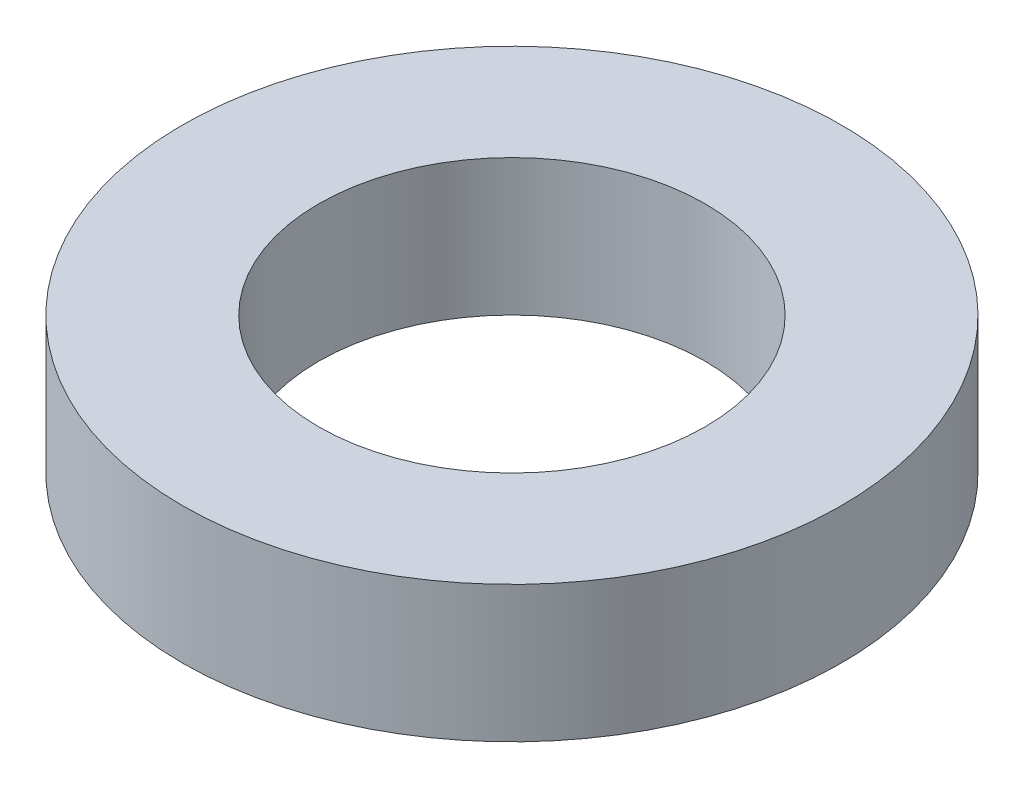
ISO-10303-21;
HEADER;
FILE_DESCRIPTION(('STEP AP214'),'2;1');
FILE_NAME('part.step','',(''),(''),'','','');
FILE_SCHEMA(('AUTOMOTIVE_DESIGN { 1 0 10303 214 1 1 1 1 }'));
ENDSEC;
DATA;
#1=APPLICATION_CONTEXT('core data for automotive mechanical design processes');
#2=APPLICATION_PROTOCOL_DEFINITION('international standard','automotive_design',2000,#1);
#3=PRODUCT_CONTEXT('',#1,'mechanical');
#4=PRODUCT('Part','Part','',(#3));
#5=PRODUCT_RELATED_PRODUCT_CATEGORY('part','',(#4));
#6=PRODUCT_DEFINITION_FORMATION('','',#4);
#7=PRODUCT_DEFINITION_CONTEXT('part definition',#1,'design');
#8=PRODUCT_DEFINITION('design','',#6,#7);
#9=PRODUCT_DEFINITION_SHAPE('','',#8);
#10=(LENGTH_UNIT() NAMED_UNIT(*) SI_UNIT(.MILLI.,.METRE.));
#11=(NAMED_UNIT(*) PLANE_ANGLE_UNIT() SI_UNIT($,.RADIAN.));
#12=(NAMED_UNIT(*) SI_UNIT($,.STERADIAN.) SOLID_ANGLE_UNIT());
#13=UNCERTAINTY_MEASURE_WITH_UNIT(LENGTH_MEASURE(1.E-05),#10,'distance_accuracy_value','');
#14=(GEOMETRIC_REPRESENTATION_CONTEXT(3) GLOBAL_UNCERTAINTY_ASSIGNED_CONTEXT((#13)) GLOBAL_UNIT_ASSIGNED_CONTEXT((#10,
#11,#12)) REPRESENTATION_CONTEXT('',''));
#15=CARTESIAN_POINT('',(0.,0.,0.));
#16=DIRECTION('',(0.,0.,1.));
#17=DIRECTION('',(1.,0.,0.));
#18=AXIS2_PLACEMENT_3D('',#15,#16,#17);
#19=CARTESIAN_POINT('',(0.,3.,0.));
#20=DIRECTION('',(0.,1.,0.));
#21=DIRECTION('',(0.,0.,1.));
#22=AXIS2_PLACEMENT_3D('',#19,#20,#21);
#23=PLANE('',#22);
#24=CARTESIAN_POINT('',(0.,3.,0.));
#25=DIRECTION('',(0.,1.,0.));
#26=DIRECTION('',(0.,0.,1.));
#27=AXIS2_PLACEMENT_3D('',#24,#25,#26);
#28=CIRCLE('',#27,7.25);
#29=CARTESIAN_POINT('',(0.,3.,7.25));
#30=VERTEX_POINT('',#29);
#31=EDGE_CURVE('E10',#30,#30,#28,.T.);
#32=ORIENTED_EDGE('',*,*,#31,.T.);
#33=EDGE_LOOP('',(#32));
#34=FACE_BOUND('',#33,.T.);
#35=CARTESIAN_POINT('',(0.,3.,0.));
#36=DIRECTION('',(0.,1.,0.));
#37=DIRECTION('',(0.,0.,1.));
#38=AXIS2_PLACEMENT_3D('',#35,#36,#37);
#39=CIRCLE('',#38,4.25);
#40=CARTESIAN_POINT('',(0.,3.,4.25));
#41=VERTEX_POINT('',#40);
#42=EDGE_CURVE('E42',#41,#41,#39,.T.);
#43=ORIENTED_EDGE('',*,*,#42,.F.);
#44=EDGE_LOOP('',(#43));
#45=FACE_BOUND('',#44,.T.);
#46=ADVANCED_FACE('F31',(#34,#45),#23,.T.);
#47=CARTESIAN_POINT('',(0.,0.,0.));
#48=DIRECTION('',(0.,1.,0.));
#49=DIRECTION('',(0.,0.,1.));
#50=AXIS2_PLACEMENT_3D('',#47,#48,#49);
#51=PLANE('',#50);
#52=CARTESIAN_POINT('',(0.,0.,0.));
#53=DIRECTION('',(0.,1.,0.));
#54=DIRECTION('',(0.,0.,1.));
#55=AXIS2_PLACEMENT_3D('',#52,#53,#54);
#56=CIRCLE('',#55,7.25);
#57=CARTESIAN_POINT('',(0.,0.,7.25));
#58=VERTEX_POINT('',#57);
#59=EDGE_CURVE('E35',#58,#58,#56,.T.);
#60=ORIENTED_EDGE('',*,*,#59,.F.);
#61=EDGE_LOOP('',(#60));
#62=FACE_BOUND('',#61,.T.);
#63=CARTESIAN_POINT('',(0.,0.,0.));
#64=DIRECTION('',(0.,1.,0.));
#65=DIRECTION('',(0.,0.,1.));
#66=AXIS2_PLACEMENT_3D('',#63,#64,#65);
#67=CIRCLE('',#66,4.25);
#68=CARTESIAN_POINT('',(0.,0.,4.25));
#69=VERTEX_POINT('',#68);
#70=EDGE_CURVE('E44',#69,#69,#67,.T.);
#71=ORIENTED_EDGE('',*,*,#70,.T.);
#72=EDGE_LOOP('',(#71));
#73=FACE_BOUND('',#72,.T.);
#74=ADVANCED_FACE('F54',(#62,#73),#51,.F.);
#75=CARTESIAN_POINT('',(0.,3.,0.));
#76=DIRECTION('',(0.,-1.,0.));
#77=DIRECTION('',(0.,0.,-1.));
#78=AXIS2_PLACEMENT_3D('',#75,#76,#77);
#79=CYLINDRICAL_SURFACE('',#78,7.25);
#80=ORIENTED_EDGE('',*,*,#31,.F.);
#81=EDGE_LOOP('',(#80));
#82=FACE_BOUND('',#81,.T.);
#83=ORIENTED_EDGE('',*,*,#59,.T.);
#84=EDGE_LOOP('',(#83));
#85=FACE_BOUND('',#84,.T.);
#86=ADVANCED_FACE('F33',(#82,#85),#79,.T.);
#87=CARTESIAN_POINT('',(0.,3.,0.));
#88=DIRECTION('',(0.,-1.,0.));
#89=DIRECTION('',(0.,0.,-1.));
#90=AXIS2_PLACEMENT_3D('',#87,#88,#89);
#91=CYLINDRICAL_SURFACE('',#90,4.25);
#92=ORIENTED_EDGE('',*,*,#42,.T.);
#93=EDGE_LOOP('',(#92));
#94=FACE_BOUND('',#93,.T.);
#95=ORIENTED_EDGE('',*,*,#70,.F.);
#96=EDGE_LOOP('',(#95));
#97=FACE_BOUND('',#96,.T.);
#98=ADVANCED_FACE('F50',(#94,#97),#91,.F.);
#99=CLOSED_SHELL('',(#46,#74,#86,#98));
#100=MANIFOLD_SOLID_BREP('B2',#99);
#101=ADVANCED_BREP_SHAPE_REPRESENTATION('',(#18,#100),#14);
#102=SHAPE_DEFINITION_REPRESENTATION(#9,#101);
ENDSEC;
END-ISO-10303-21;
